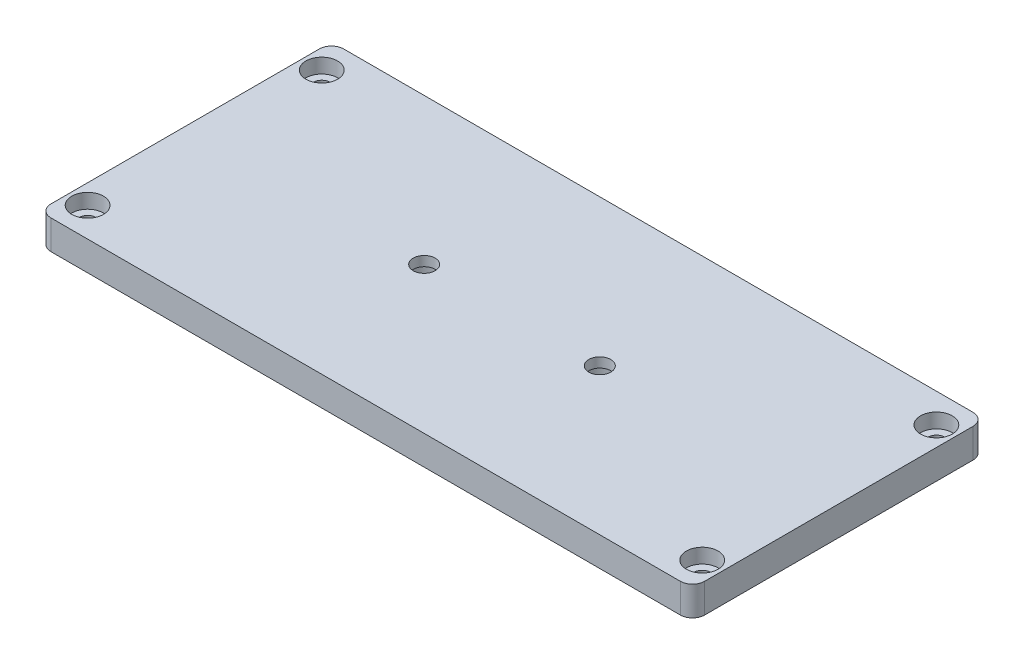
ISO-10303-21;
HEADER;
FILE_DESCRIPTION(('STEP AP214'),'2;1');
FILE_NAME('part.step','',(''),(''),'','','');
FILE_SCHEMA(('AUTOMOTIVE_DESIGN { 1 0 10303 214 1 1 1 1 }'));
ENDSEC;
DATA;
#1=APPLICATION_CONTEXT('core data for automotive mechanical design processes');
#2=APPLICATION_PROTOCOL_DEFINITION('international standard','automotive_design',2000,#1);
#3=PRODUCT_CONTEXT('',#1,'mechanical');
#4=PRODUCT('Part','Part','',(#3));
#5=PRODUCT_RELATED_PRODUCT_CATEGORY('part','',(#4));
#6=PRODUCT_DEFINITION_FORMATION('','',#4);
#7=PRODUCT_DEFINITION_CONTEXT('part definition',#1,'design');
#8=PRODUCT_DEFINITION('design','',#6,#7);
#9=PRODUCT_DEFINITION_SHAPE('','',#8);
#10=(LENGTH_UNIT() NAMED_UNIT(*) SI_UNIT(.MILLI.,.METRE.));
#11=(NAMED_UNIT(*) PLANE_ANGLE_UNIT() SI_UNIT($,.RADIAN.));
#12=(NAMED_UNIT(*) SI_UNIT($,.STERADIAN.) SOLID_ANGLE_UNIT());
#13=UNCERTAINTY_MEASURE_WITH_UNIT(LENGTH_MEASURE(1.E-05),#10,'distance_accuracy_value','');
#14=(GEOMETRIC_REPRESENTATION_CONTEXT(3) GLOBAL_UNCERTAINTY_ASSIGNED_CONTEXT((#13)) GLOBAL_UNIT_ASSIGNED_CONTEXT((#10,
#11,#12)) REPRESENTATION_CONTEXT('',''));
#15=CARTESIAN_POINT('',(0.,0.,0.));
#16=DIRECTION('',(0.,0.,1.));
#17=DIRECTION('',(1.,0.,0.));
#18=AXIS2_PLACEMENT_3D('',#15,#16,#17);
#19=CARTESIAN_POINT('',(0.,0.,0.));
#20=DIRECTION('',(0.,1.,0.));
#21=DIRECTION('',(0.,0.,1.));
#22=AXIS2_PLACEMENT_3D('',#19,#20,#21);
#23=PLANE('',#22);
#24=CARTESIAN_POINT('',(-18.,0.,0.));
#25=DIRECTION('',(0.,-1.,0.));
#26=DIRECTION('',(0.,0.,-1.));
#27=AXIS2_PLACEMENT_3D('',#24,#25,#26);
#28=CIRCLE('',#27,4.);
#29=CARTESIAN_POINT('',(-18.,0.,-4.));
#30=VERTEX_POINT('',#29);
#31=EDGE_CURVE('E605',#30,#30,#28,.T.);
#32=ORIENTED_EDGE('',*,*,#31,.F.);
#33=EDGE_LOOP('',(#32));
#34=FACE_BOUND('',#33,.T.);
#35=CARTESIAN_POINT('',(-63.,0.,-24.));
#36=DIRECTION('',(0.,1.,0.));
#37=DIRECTION('',(0.,0.,1.));
#38=AXIS2_PLACEMENT_3D('',#35,#36,#37);
#39=CIRCLE('',#38,1.7);
#40=CARTESIAN_POINT('',(-63.,0.,-22.3));
#41=VERTEX_POINT('',#40);
#42=EDGE_CURVE('E156',#41,#41,#39,.T.);
#43=ORIENTED_EDGE('',*,*,#42,.T.);
#44=EDGE_LOOP('',(#43));
#45=FACE_BOUND('',#44,.T.);
#46=CARTESIAN_POINT('',(-63.,0.,24.));
#47=DIRECTION('',(0.,1.,0.));
#48=DIRECTION('',(0.,0.,1.));
#49=AXIS2_PLACEMENT_3D('',#46,#47,#48);
#50=CIRCLE('',#49,1.7);
#51=CARTESIAN_POINT('',(-63.,0.,25.7));
#52=VERTEX_POINT('',#51);
#53=EDGE_CURVE('E151',#52,#52,#50,.T.);
#54=ORIENTED_EDGE('',*,*,#53,.T.);
#55=EDGE_LOOP('',(#54));
#56=FACE_BOUND('',#55,.T.);
#57=CARTESIAN_POINT('',(63.,0.,24.));
#58=DIRECTION('',(0.,1.,0.));
#59=DIRECTION('',(0.,0.,1.));
#60=AXIS2_PLACEMENT_3D('',#57,#58,#59);
#61=CIRCLE('',#60,1.69999999999999);
#62=CARTESIAN_POINT('',(63.,0.,25.7));
#63=VERTEX_POINT('',#62);
#64=EDGE_CURVE('E146',#63,#63,#61,.T.);
#65=ORIENTED_EDGE('',*,*,#64,.T.);
#66=EDGE_LOOP('',(#65));
#67=FACE_BOUND('',#66,.T.);
#68=CARTESIAN_POINT('',(63.,0.,-24.));
#69=DIRECTION('',(0.,1.,0.));
#70=DIRECTION('',(0.,0.,1.));
#71=AXIS2_PLACEMENT_3D('',#68,#69,#70);
#72=CIRCLE('',#71,1.69999999999999);
#73=CARTESIAN_POINT('',(63.,0.,-22.3));
#74=VERTEX_POINT('',#73);
#75=EDGE_CURVE('E137',#74,#74,#72,.T.);
#76=ORIENTED_EDGE('',*,*,#75,.T.);
#77=EDGE_LOOP('',(#76));
#78=FACE_BOUND('',#77,.T.);
#79=DIRECTION('',(-1.,0.,0.));
#80=VECTOR('',#79,1.);
#81=CARTESIAN_POINT('',(-67.,0.,-30.));
#82=LINE('',#81,#80);
#83=CARTESIAN_POINT('',(64.5,0.,-30.));
#84=VERTEX_POINT('',#83);
#85=CARTESIAN_POINT('',(-64.5,0.,-30.));
#86=VERTEX_POINT('',#85);
#87=EDGE_CURVE('E122',#84,#86,#82,.T.);
#88=ORIENTED_EDGE('',*,*,#87,.F.);
#89=CARTESIAN_POINT('',(64.5,0.,-27.5));
#90=DIRECTION('',(0.,1.,0.));
#91=DIRECTION('',(0.,0.,1.));
#92=AXIS2_PLACEMENT_3D('',#89,#90,#91);
#93=CIRCLE('',#92,2.5);
#94=CARTESIAN_POINT('',(67.,0.,-27.5));
#95=VERTEX_POINT('',#94);
#96=EDGE_CURVE('E105',#84,#95,#93,.F.);
#97=ORIENTED_EDGE('',*,*,#96,.T.);
#98=DIRECTION('',(0.,0.,-1.));
#99=VECTOR('',#98,1.);
#100=CARTESIAN_POINT('',(67.,0.,-30.));
#101=LINE('',#100,#99);
#102=CARTESIAN_POINT('',(67.,0.,27.5));
#103=VERTEX_POINT('',#102);
#104=EDGE_CURVE('E132',#103,#95,#101,.T.);
#105=ORIENTED_EDGE('',*,*,#104,.F.);
#106=CARTESIAN_POINT('',(64.5,0.,27.5));
#107=DIRECTION('',(0.,1.,0.));
#108=DIRECTION('',(0.,0.,1.));
#109=AXIS2_PLACEMENT_3D('',#106,#107,#108);
#110=CIRCLE('',#109,2.5);
#111=CARTESIAN_POINT('',(64.5,0.,30.));
#112=VERTEX_POINT('',#111);
#113=EDGE_CURVE('E116',#103,#112,#110,.F.);
#114=ORIENTED_EDGE('',*,*,#113,.T.);
#115=DIRECTION('',(1.,0.,0.));
#116=VECTOR('',#115,1.);
#117=CARTESIAN_POINT('',(-67.,0.,30.));
#118=LINE('',#117,#116);
#119=CARTESIAN_POINT('',(-64.5,0.,30.));
#120=VERTEX_POINT('',#119);
#121=EDGE_CURVE('E135',#120,#112,#118,.T.);
#122=ORIENTED_EDGE('',*,*,#121,.F.);
#123=CARTESIAN_POINT('',(-64.5,0.,27.5));
#124=DIRECTION('',(0.,1.,0.));
#125=DIRECTION('',(0.,0.,1.));
#126=AXIS2_PLACEMENT_3D('',#123,#124,#125);
#127=CIRCLE('',#126,2.5);
#128=CARTESIAN_POINT('',(-67.,0.,27.5));
#129=VERTEX_POINT('',#128);
#130=EDGE_CURVE('E164',#120,#129,#127,.F.);
#131=ORIENTED_EDGE('',*,*,#130,.T.);
#132=DIRECTION('',(0.,0.,1.));
#133=VECTOR('',#132,1.);
#134=CARTESIAN_POINT('',(-67.,0.,-30.));
#135=LINE('',#134,#133);
#136=CARTESIAN_POINT('',(-67.,0.,-27.5));
#137=VERTEX_POINT('',#136);
#138=EDGE_CURVE('E131',#137,#129,#135,.T.);
#139=ORIENTED_EDGE('',*,*,#138,.F.);
#140=CARTESIAN_POINT('',(-64.5,0.,-27.5));
#141=DIRECTION('',(0.,1.,0.));
#142=DIRECTION('',(0.,0.,1.));
#143=AXIS2_PLACEMENT_3D('',#140,#141,#142);
#144=CIRCLE('',#143,2.5);
#145=EDGE_CURVE('E126',#137,#86,#144,.F.);
#146=ORIENTED_EDGE('',*,*,#145,.T.);
#147=EDGE_LOOP('',(#88,#97,#105,#114,#122,#131,#139,#146));
#148=FACE_BOUND('',#147,.T.);
#149=CARTESIAN_POINT('',(18.,0.,0.));
#150=DIRECTION('',(0.,-1.,0.));
#151=DIRECTION('',(0.,0.,-1.));
#152=AXIS2_PLACEMENT_3D('',#149,#150,#151);
#153=CIRCLE('',#152,4.);
#154=CARTESIAN_POINT('',(18.,0.,-4.00000000000001));
#155=VERTEX_POINT('',#154);
#156=EDGE_CURVE('E197',#155,#155,#153,.T.);
#157=ORIENTED_EDGE('',*,*,#156,.F.);
#158=EDGE_LOOP('',(#157));
#159=FACE_BOUND('',#158,.T.);
#160=ADVANCED_FACE('F37',(#34,#45,#56,#67,#78,#148,#159),#23,.F.);
#161=CARTESIAN_POINT('',(67.,6.,-30.));
#162=DIRECTION('',(-1.,0.,0.));
#163=DIRECTION('',(0.,0.,1.));
#164=AXIS2_PLACEMENT_3D('',#161,#162,#163);
#165=PLANE('',#164);
#166=ORIENTED_EDGE('',*,*,#104,.T.);
#167=DIRECTION('',(0.,-1.,0.));
#168=VECTOR('',#167,1.);
#169=CARTESIAN_POINT('',(67.,6.,-27.5));
#170=LINE('',#169,#168);
#171=CARTESIAN_POINT('',(67.,6.,-27.5));
#172=VERTEX_POINT('',#171);
#173=EDGE_CURVE('E110',#95,#172,#170,.F.);
#174=ORIENTED_EDGE('',*,*,#173,.T.);
#175=DIRECTION('',(0.,0.,-1.));
#176=VECTOR('',#175,1.);
#177=CARTESIAN_POINT('',(67.,6.,-30.));
#178=LINE('',#177,#176);
#179=CARTESIAN_POINT('',(67.,6.,27.5));
#180=VERTEX_POINT('',#179);
#181=EDGE_CURVE('E142',#180,#172,#178,.T.);
#182=ORIENTED_EDGE('',*,*,#181,.F.);
#183=DIRECTION('',(0.,-1.,0.));
#184=VECTOR('',#183,1.);
#185=CARTESIAN_POINT('',(67.,6.,27.5));
#186=LINE('',#185,#184);
#187=EDGE_CURVE('E115',#180,#103,#186,.T.);
#188=ORIENTED_EDGE('',*,*,#187,.T.);
#189=EDGE_LOOP('',(#166,#174,#182,#188));
#190=FACE_BOUND('',#189,.T.);
#191=ADVANCED_FACE('F238',(#190),#165,.F.);
#192=CARTESIAN_POINT('',(-67.,6.,-30.));
#193=DIRECTION('',(0.,0.,1.));
#194=DIRECTION('',(1.,0.,0.));
#195=AXIS2_PLACEMENT_3D('',#192,#193,#194);
#196=PLANE('',#195);
#197=DIRECTION('',(-1.,0.,0.));
#198=VECTOR('',#197,1.);
#199=CARTESIAN_POINT('',(-67.,6.,-30.));
#200=LINE('',#199,#198);
#201=CARTESIAN_POINT('',(64.5,6.,-30.));
#202=VERTEX_POINT('',#201);
#203=CARTESIAN_POINT('',(-64.5,6.,-30.));
#204=VERTEX_POINT('',#203);
#205=EDGE_CURVE('E125',#202,#204,#200,.T.);
#206=ORIENTED_EDGE('',*,*,#205,.F.);
#207=DIRECTION('',(0.,-1.,0.));
#208=VECTOR('',#207,1.);
#209=CARTESIAN_POINT('',(64.5,6.,-30.));
#210=LINE('',#209,#208);
#211=EDGE_CURVE('E109',#202,#84,#210,.T.);
#212=ORIENTED_EDGE('',*,*,#211,.T.);
#213=ORIENTED_EDGE('',*,*,#87,.T.);
#214=DIRECTION('',(0.,-1.,0.));
#215=VECTOR('',#214,1.);
#216=CARTESIAN_POINT('',(-64.5,6.,-30.));
#217=LINE('',#216,#215);
#218=EDGE_CURVE('E127',#86,#204,#217,.F.);
#219=ORIENTED_EDGE('',*,*,#218,.T.);
#220=EDGE_LOOP('',(#206,#212,#213,#219));
#221=FACE_BOUND('',#220,.T.);
#222=ADVANCED_FACE('F121',(#221),#196,.F.);
#223=CARTESIAN_POINT('',(-67.,6.,-30.));
#224=DIRECTION('',(1.,0.,0.));
#225=DIRECTION('',(0.,0.,-1.));
#226=AXIS2_PLACEMENT_3D('',#223,#224,#225);
#227=PLANE('',#226);
#228=ORIENTED_EDGE('',*,*,#138,.T.);
#229=DIRECTION('',(0.,-1.,0.));
#230=VECTOR('',#229,1.);
#231=CARTESIAN_POINT('',(-67.,6.,27.5));
#232=LINE('',#231,#230);
#233=CARTESIAN_POINT('',(-67.,6.,27.5));
#234=VERTEX_POINT('',#233);
#235=EDGE_CURVE('E11',#129,#234,#232,.F.);
#236=ORIENTED_EDGE('',*,*,#235,.T.);
#237=DIRECTION('',(0.,0.,1.));
#238=VECTOR('',#237,1.);
#239=CARTESIAN_POINT('',(-67.,6.,-30.));
#240=LINE('',#239,#238);
#241=CARTESIAN_POINT('',(-67.,6.,-27.5));
#242=VERTEX_POINT('',#241);
#243=EDGE_CURVE('E229',#242,#234,#240,.T.);
#244=ORIENTED_EDGE('',*,*,#243,.F.);
#245=DIRECTION('',(0.,-1.,0.));
#246=VECTOR('',#245,1.);
#247=CARTESIAN_POINT('',(-67.,6.,-27.5));
#248=LINE('',#247,#246);
#249=EDGE_CURVE('E46',#242,#137,#248,.T.);
#250=ORIENTED_EDGE('',*,*,#249,.T.);
#251=EDGE_LOOP('',(#228,#236,#244,#250));
#252=FACE_BOUND('',#251,.T.);
#253=ADVANCED_FACE('F245',(#252),#227,.F.);
#254=CARTESIAN_POINT('',(-67.,6.,30.));
#255=DIRECTION('',(0.,0.,-1.));
#256=DIRECTION('',(-1.,0.,0.));
#257=AXIS2_PLACEMENT_3D('',#254,#255,#256);
#258=PLANE('',#257);
#259=ORIENTED_EDGE('',*,*,#121,.T.);
#260=DIRECTION('',(0.,-1.,0.));
#261=VECTOR('',#260,1.);
#262=CARTESIAN_POINT('',(64.5,6.,30.));
#263=LINE('',#262,#261);
#264=CARTESIAN_POINT('',(64.5,6.,30.));
#265=VERTEX_POINT('',#264);
#266=EDGE_CURVE('E54',#112,#265,#263,.F.);
#267=ORIENTED_EDGE('',*,*,#266,.T.);
#268=DIRECTION('',(1.,0.,0.));
#269=VECTOR('',#268,1.);
#270=CARTESIAN_POINT('',(-67.,6.,30.));
#271=LINE('',#270,#269);
#272=CARTESIAN_POINT('',(-64.5,6.,30.));
#273=VERTEX_POINT('',#272);
#274=EDGE_CURVE('E161',#273,#265,#271,.T.);
#275=ORIENTED_EDGE('',*,*,#274,.F.);
#276=DIRECTION('',(0.,-1.,0.));
#277=VECTOR('',#276,1.);
#278=CARTESIAN_POINT('',(-64.5,6.,30.));
#279=LINE('',#278,#277);
#280=EDGE_CURVE('E177',#273,#120,#279,.T.);
#281=ORIENTED_EDGE('',*,*,#280,.T.);
#282=EDGE_LOOP('',(#259,#267,#275,#281));
#283=FACE_BOUND('',#282,.T.);
#284=ADVANCED_FACE('F240',(#283),#258,.F.);
#285=CARTESIAN_POINT('',(0.,6.,0.));
#286=DIRECTION('',(0.,1.,0.));
#287=DIRECTION('',(0.,0.,1.));
#288=AXIS2_PLACEMENT_3D('',#285,#286,#287);
#289=PLANE('',#288);
#290=CARTESIAN_POINT('',(-18.,6.,0.));
#291=DIRECTION('',(0.,1.,0.));
#292=DIRECTION('',(0.,0.,1.));
#293=AXIS2_PLACEMENT_3D('',#290,#291,#292);
#294=CIRCLE('',#293,2.25);
#295=CARTESIAN_POINT('',(-18.,6.,2.25));
#296=VERTEX_POINT('',#295);
#297=EDGE_CURVE('E41',#296,#296,#294,.T.);
#298=ORIENTED_EDGE('',*,*,#297,.F.);
#299=EDGE_LOOP('',(#298));
#300=FACE_BOUND('',#299,.T.);
#301=CARTESIAN_POINT('',(18.,6.,0.));
#302=DIRECTION('',(0.,1.,0.));
#303=DIRECTION('',(0.,0.,1.));
#304=AXIS2_PLACEMENT_3D('',#301,#302,#303);
#305=CIRCLE('',#304,2.25);
#306=CARTESIAN_POINT('',(18.,6.,2.24999999999999));
#307=VERTEX_POINT('',#306);
#308=EDGE_CURVE('E182',#307,#307,#305,.T.);
#309=ORIENTED_EDGE('',*,*,#308,.F.);
#310=EDGE_LOOP('',(#309));
#311=FACE_BOUND('',#310,.T.);
#312=CARTESIAN_POINT('',(-63.,6.,-24.));
#313=DIRECTION('',(0.,1.,0.));
#314=DIRECTION('',(0.,0.,1.));
#315=AXIS2_PLACEMENT_3D('',#312,#313,#314);
#316=CIRCLE('',#315,3.25);
#317=CARTESIAN_POINT('',(-63.,6.,-20.75));
#318=VERTEX_POINT('',#317);
#319=EDGE_CURVE('E184',#318,#318,#316,.T.);
#320=ORIENTED_EDGE('',*,*,#319,.F.);
#321=EDGE_LOOP('',(#320));
#322=FACE_BOUND('',#321,.T.);
#323=CARTESIAN_POINT('',(-63.,6.,24.));
#324=DIRECTION('',(0.,1.,0.));
#325=DIRECTION('',(0.,0.,1.));
#326=AXIS2_PLACEMENT_3D('',#323,#324,#325);
#327=CIRCLE('',#326,3.25);
#328=CARTESIAN_POINT('',(-63.,6.,27.25));
#329=VERTEX_POINT('',#328);
#330=EDGE_CURVE('E159',#329,#329,#327,.T.);
#331=ORIENTED_EDGE('',*,*,#330,.F.);
#332=EDGE_LOOP('',(#331));
#333=FACE_BOUND('',#332,.T.);
#334=CARTESIAN_POINT('',(63.,6.,24.));
#335=DIRECTION('',(0.,1.,0.));
#336=DIRECTION('',(0.,0.,1.));
#337=AXIS2_PLACEMENT_3D('',#334,#335,#336);
#338=CIRCLE('',#337,3.25);
#339=CARTESIAN_POINT('',(63.,6.,27.25));
#340=VERTEX_POINT('',#339);
#341=EDGE_CURVE('E154',#340,#340,#338,.T.);
#342=ORIENTED_EDGE('',*,*,#341,.F.);
#343=EDGE_LOOP('',(#342));
#344=FACE_BOUND('',#343,.T.);
#345=CARTESIAN_POINT('',(63.,6.,-24.));
#346=DIRECTION('',(0.,1.,0.));
#347=DIRECTION('',(0.,0.,1.));
#348=AXIS2_PLACEMENT_3D('',#345,#346,#347);
#349=CIRCLE('',#348,3.25);
#350=CARTESIAN_POINT('',(63.,6.,-20.75));
#351=VERTEX_POINT('',#350);
#352=EDGE_CURVE('E149',#351,#351,#349,.T.);
#353=ORIENTED_EDGE('',*,*,#352,.F.);
#354=EDGE_LOOP('',(#353));
#355=FACE_BOUND('',#354,.T.);
#356=ORIENTED_EDGE('',*,*,#181,.T.);
#357=CARTESIAN_POINT('',(64.5,6.,-27.5));
#358=DIRECTION('',(0.,1.,0.));
#359=DIRECTION('',(0.,0.,1.));
#360=AXIS2_PLACEMENT_3D('',#357,#358,#359);
#361=CIRCLE('',#360,2.5);
#362=EDGE_CURVE('E175',#172,#202,#361,.T.);
#363=ORIENTED_EDGE('',*,*,#362,.T.);
#364=ORIENTED_EDGE('',*,*,#205,.T.);
#365=CARTESIAN_POINT('',(-64.5,6.,-27.5));
#366=DIRECTION('',(0.,1.,0.));
#367=DIRECTION('',(0.,0.,1.));
#368=AXIS2_PLACEMENT_3D('',#365,#366,#367);
#369=CIRCLE('',#368,2.5);
#370=EDGE_CURVE('E170',#204,#242,#369,.T.);
#371=ORIENTED_EDGE('',*,*,#370,.T.);
#372=ORIENTED_EDGE('',*,*,#243,.T.);
#373=CARTESIAN_POINT('',(-64.5,6.,27.5));
#374=DIRECTION('',(0.,1.,0.));
#375=DIRECTION('',(0.,0.,1.));
#376=AXIS2_PLACEMENT_3D('',#373,#374,#375);
#377=CIRCLE('',#376,2.5);
#378=EDGE_CURVE('E61',#234,#273,#377,.T.);
#379=ORIENTED_EDGE('',*,*,#378,.T.);
#380=ORIENTED_EDGE('',*,*,#274,.T.);
#381=CARTESIAN_POINT('',(64.5,6.,27.5));
#382=DIRECTION('',(0.,1.,0.));
#383=DIRECTION('',(0.,0.,1.));
#384=AXIS2_PLACEMENT_3D('',#381,#382,#383);
#385=CIRCLE('',#384,2.5);
#386=EDGE_CURVE('E173',#265,#180,#385,.T.);
#387=ORIENTED_EDGE('',*,*,#386,.T.);
#388=EDGE_LOOP('',(#356,#363,#364,#371,#372,#379,#380,#387));
#389=FACE_BOUND('',#388,.T.);
#390=ADVANCED_FACE('F231',(#300,#311,#322,#333,#344,#355,#389),#289,.T.);
#391=CARTESIAN_POINT('',(63.,6.,-24.));
#392=DIRECTION('',(0.,1.,0.));
#393=DIRECTION('',(0.,0.,1.));
#394=AXIS2_PLACEMENT_3D('',#391,#392,#393);
#395=CYLINDRICAL_SURFACE('',#394,1.69999999999999);
#396=CARTESIAN_POINT('',(63.,3.,-24.));
#397=DIRECTION('',(0.,1.,0.));
#398=DIRECTION('',(0.,0.,1.));
#399=AXIS2_PLACEMENT_3D('',#396,#397,#398);
#400=CIRCLE('',#399,1.69999999999999);
#401=CARTESIAN_POINT('',(63.,3.,-22.3));
#402=VERTEX_POINT('',#401);
#403=EDGE_CURVE('E145',#402,#402,#400,.T.);
#404=ORIENTED_EDGE('',*,*,#403,.T.);
#405=EDGE_LOOP('',(#404));
#406=FACE_BOUND('',#405,.T.);
#407=ORIENTED_EDGE('',*,*,#75,.F.);
#408=EDGE_LOOP('',(#407));
#409=FACE_BOUND('',#408,.T.);
#410=ADVANCED_FACE('F309',(#406,#409),#395,.F.);
#411=CARTESIAN_POINT('',(64.7,3.,-24.));
#412=DIRECTION('',(0.,-1.,0.));
#413=DIRECTION('',(0.,0.,-1.));
#414=AXIS2_PLACEMENT_3D('',#411,#412,#413);
#415=PLANE('',#414);
#416=ORIENTED_EDGE('',*,*,#403,.F.);
#417=EDGE_LOOP('',(#416));
#418=FACE_BOUND('',#417,.T.);
#419=CARTESIAN_POINT('',(63.,3.,-24.));
#420=DIRECTION('',(0.,1.,0.));
#421=DIRECTION('',(0.,0.,1.));
#422=AXIS2_PLACEMENT_3D('',#419,#420,#421);
#423=CIRCLE('',#422,3.25);
#424=CARTESIAN_POINT('',(63.,3.,-20.75));
#425=VERTEX_POINT('',#424);
#426=EDGE_CURVE('E221',#425,#425,#423,.T.);
#427=ORIENTED_EDGE('',*,*,#426,.T.);
#428=EDGE_LOOP('',(#427));
#429=FACE_BOUND('',#428,.T.);
#430=ADVANCED_FACE('F423',(#418,#429),#415,.F.);
#431=CARTESIAN_POINT('',(63.,6.,-24.));
#432=DIRECTION('',(0.,1.,0.));
#433=DIRECTION('',(0.,0.,1.));
#434=AXIS2_PLACEMENT_3D('',#431,#432,#433);
#435=CYLINDRICAL_SURFACE('',#434,3.25);
#436=ORIENTED_EDGE('',*,*,#426,.F.);
#437=EDGE_LOOP('',(#436));
#438=FACE_BOUND('',#437,.T.);
#439=ORIENTED_EDGE('',*,*,#352,.T.);
#440=EDGE_LOOP('',(#439));
#441=FACE_BOUND('',#440,.T.);
#442=ADVANCED_FACE('F419',(#438,#441),#435,.F.);
#443=CARTESIAN_POINT('',(63.,6.,24.));
#444=DIRECTION('',(0.,1.,0.));
#445=DIRECTION('',(0.,0.,1.));
#446=AXIS2_PLACEMENT_3D('',#443,#444,#445);
#447=CYLINDRICAL_SURFACE('',#446,1.69999999999999);
#448=CARTESIAN_POINT('',(63.,3.,24.));
#449=DIRECTION('',(0.,1.,0.));
#450=DIRECTION('',(0.,0.,1.));
#451=AXIS2_PLACEMENT_3D('',#448,#449,#450);
#452=CIRCLE('',#451,1.69999999999999);
#453=CARTESIAN_POINT('',(63.,3.,25.7));
#454=VERTEX_POINT('',#453);
#455=EDGE_CURVE('E150',#454,#454,#452,.T.);
#456=ORIENTED_EDGE('',*,*,#455,.T.);
#457=EDGE_LOOP('',(#456));
#458=FACE_BOUND('',#457,.T.);
#459=ORIENTED_EDGE('',*,*,#64,.F.);
#460=EDGE_LOOP('',(#459));
#461=FACE_BOUND('',#460,.T.);
#462=ADVANCED_FACE('F415',(#458,#461),#447,.F.);
#463=CARTESIAN_POINT('',(64.7,3.,24.));
#464=DIRECTION('',(0.,-1.,0.));
#465=DIRECTION('',(0.,0.,-1.));
#466=AXIS2_PLACEMENT_3D('',#463,#464,#465);
#467=PLANE('',#466);
#468=ORIENTED_EDGE('',*,*,#455,.F.);
#469=EDGE_LOOP('',(#468));
#470=FACE_BOUND('',#469,.T.);
#471=CARTESIAN_POINT('',(63.,3.,24.));
#472=DIRECTION('',(0.,1.,0.));
#473=DIRECTION('',(0.,0.,1.));
#474=AXIS2_PLACEMENT_3D('',#471,#472,#473);
#475=CIRCLE('',#474,3.25);
#476=CARTESIAN_POINT('',(63.,3.,27.25));
#477=VERTEX_POINT('',#476);
#478=EDGE_CURVE('E214',#477,#477,#475,.T.);
#479=ORIENTED_EDGE('',*,*,#478,.T.);
#480=EDGE_LOOP('',(#479));
#481=FACE_BOUND('',#480,.T.);
#482=ADVANCED_FACE('F411',(#470,#481),#467,.F.);
#483=CARTESIAN_POINT('',(63.,6.,24.));
#484=DIRECTION('',(0.,1.,0.));
#485=DIRECTION('',(0.,0.,1.));
#486=AXIS2_PLACEMENT_3D('',#483,#484,#485);
#487=CYLINDRICAL_SURFACE('',#486,3.25);
#488=ORIENTED_EDGE('',*,*,#478,.F.);
#489=EDGE_LOOP('',(#488));
#490=FACE_BOUND('',#489,.T.);
#491=ORIENTED_EDGE('',*,*,#341,.T.);
#492=EDGE_LOOP('',(#491));
#493=FACE_BOUND('',#492,.T.);
#494=ADVANCED_FACE('F407',(#490,#493),#487,.F.);
#495=CARTESIAN_POINT('',(-63.,6.,24.));
#496=DIRECTION('',(0.,1.,0.));
#497=DIRECTION('',(0.,0.,1.));
#498=AXIS2_PLACEMENT_3D('',#495,#496,#497);
#499=CYLINDRICAL_SURFACE('',#498,1.7);
#500=CARTESIAN_POINT('',(-63.,3.,24.));
#501=DIRECTION('',(0.,1.,0.));
#502=DIRECTION('',(0.,0.,1.));
#503=AXIS2_PLACEMENT_3D('',#500,#501,#502);
#504=CIRCLE('',#503,1.7);
#505=CARTESIAN_POINT('',(-63.,3.,25.7));
#506=VERTEX_POINT('',#505);
#507=EDGE_CURVE('E155',#506,#506,#504,.T.);
#508=ORIENTED_EDGE('',*,*,#507,.T.);
#509=EDGE_LOOP('',(#508));
#510=FACE_BOUND('',#509,.T.);
#511=ORIENTED_EDGE('',*,*,#53,.F.);
#512=EDGE_LOOP('',(#511));
#513=FACE_BOUND('',#512,.T.);
#514=ADVANCED_FACE('F403',(#510,#513),#499,.F.);
#515=CARTESIAN_POINT('',(-61.3,3.,24.));
#516=DIRECTION('',(0.,-1.,0.));
#517=DIRECTION('',(0.,0.,-1.));
#518=AXIS2_PLACEMENT_3D('',#515,#516,#517);
#519=PLANE('',#518);
#520=ORIENTED_EDGE('',*,*,#507,.F.);
#521=EDGE_LOOP('',(#520));
#522=FACE_BOUND('',#521,.T.);
#523=CARTESIAN_POINT('',(-63.,3.,24.));
#524=DIRECTION('',(0.,1.,0.));
#525=DIRECTION('',(0.,0.,1.));
#526=AXIS2_PLACEMENT_3D('',#523,#524,#525);
#527=CIRCLE('',#526,3.25);
#528=CARTESIAN_POINT('',(-63.,3.,27.25));
#529=VERTEX_POINT('',#528);
#530=EDGE_CURVE('E207',#529,#529,#527,.T.);
#531=ORIENTED_EDGE('',*,*,#530,.T.);
#532=EDGE_LOOP('',(#531));
#533=FACE_BOUND('',#532,.T.);
#534=ADVANCED_FACE('F399',(#522,#533),#519,.F.);
#535=CARTESIAN_POINT('',(-63.,6.,24.));
#536=DIRECTION('',(0.,1.,0.));
#537=DIRECTION('',(0.,0.,1.));
#538=AXIS2_PLACEMENT_3D('',#535,#536,#537);
#539=CYLINDRICAL_SURFACE('',#538,3.25);
#540=ORIENTED_EDGE('',*,*,#530,.F.);
#541=EDGE_LOOP('',(#540));
#542=FACE_BOUND('',#541,.T.);
#543=ORIENTED_EDGE('',*,*,#330,.T.);
#544=EDGE_LOOP('',(#543));
#545=FACE_BOUND('',#544,.T.);
#546=ADVANCED_FACE('F395',(#542,#545),#539,.F.);
#547=CARTESIAN_POINT('',(-63.,6.,-24.));
#548=DIRECTION('',(0.,1.,0.));
#549=DIRECTION('',(0.,0.,1.));
#550=AXIS2_PLACEMENT_3D('',#547,#548,#549);
#551=CYLINDRICAL_SURFACE('',#550,1.7);
#552=CARTESIAN_POINT('',(-63.,3.,-24.));
#553=DIRECTION('',(0.,1.,0.));
#554=DIRECTION('',(0.,0.,1.));
#555=AXIS2_PLACEMENT_3D('',#552,#553,#554);
#556=CIRCLE('',#555,1.7);
#557=CARTESIAN_POINT('',(-63.,3.,-22.3));
#558=VERTEX_POINT('',#557);
#559=EDGE_CURVE('E160',#558,#558,#556,.T.);
#560=ORIENTED_EDGE('',*,*,#559,.T.);
#561=EDGE_LOOP('',(#560));
#562=FACE_BOUND('',#561,.T.);
#563=ORIENTED_EDGE('',*,*,#42,.F.);
#564=EDGE_LOOP('',(#563));
#565=FACE_BOUND('',#564,.T.);
#566=ADVANCED_FACE('F391',(#562,#565),#551,.F.);
#567=CARTESIAN_POINT('',(-61.3,3.,-24.));
#568=DIRECTION('',(0.,-1.,0.));
#569=DIRECTION('',(0.,0.,-1.));
#570=AXIS2_PLACEMENT_3D('',#567,#568,#569);
#571=PLANE('',#570);
#572=ORIENTED_EDGE('',*,*,#559,.F.);
#573=EDGE_LOOP('',(#572));
#574=FACE_BOUND('',#573,.T.);
#575=CARTESIAN_POINT('',(-63.,3.,-24.));
#576=DIRECTION('',(0.,1.,0.));
#577=DIRECTION('',(0.,0.,1.));
#578=AXIS2_PLACEMENT_3D('',#575,#576,#577);
#579=CIRCLE('',#578,3.25);
#580=CARTESIAN_POINT('',(-63.,3.,-20.75));
#581=VERTEX_POINT('',#580);
#582=EDGE_CURVE('E189',#581,#581,#579,.T.);
#583=ORIENTED_EDGE('',*,*,#582,.T.);
#584=EDGE_LOOP('',(#583));
#585=FACE_BOUND('',#584,.T.);
#586=ADVANCED_FACE('F387',(#574,#585),#571,.F.);
#587=CARTESIAN_POINT('',(-63.,6.,-24.));
#588=DIRECTION('',(0.,1.,0.));
#589=DIRECTION('',(0.,0.,1.));
#590=AXIS2_PLACEMENT_3D('',#587,#588,#589);
#591=CYLINDRICAL_SURFACE('',#590,3.25);
#592=ORIENTED_EDGE('',*,*,#582,.F.);
#593=EDGE_LOOP('',(#592));
#594=FACE_BOUND('',#593,.T.);
#595=ORIENTED_EDGE('',*,*,#319,.T.);
#596=EDGE_LOOP('',(#595));
#597=FACE_BOUND('',#596,.T.);
#598=ADVANCED_FACE('F278',(#594,#597),#591,.F.);
#599=CARTESIAN_POINT('',(64.5,6.,-27.5));
#600=DIRECTION('',(0.,-1.,0.));
#601=DIRECTION('',(0.,0.,-1.));
#602=AXIS2_PLACEMENT_3D('',#599,#600,#601);
#603=CYLINDRICAL_SURFACE('',#602,2.5);
#604=ORIENTED_EDGE('',*,*,#362,.F.);
#605=ORIENTED_EDGE('',*,*,#173,.F.);
#606=ORIENTED_EDGE('',*,*,#96,.F.);
#607=ORIENTED_EDGE('',*,*,#211,.F.);
#608=EDGE_LOOP('',(#604,#605,#606,#607));
#609=FACE_BOUND('',#608,.T.);
#610=ADVANCED_FACE('F108',(#609),#603,.T.);
#611=CARTESIAN_POINT('',(64.5,6.,27.5));
#612=DIRECTION('',(0.,-1.,0.));
#613=DIRECTION('',(0.,0.,-1.));
#614=AXIS2_PLACEMENT_3D('',#611,#612,#613);
#615=CYLINDRICAL_SURFACE('',#614,2.5);
#616=ORIENTED_EDGE('',*,*,#386,.F.);
#617=ORIENTED_EDGE('',*,*,#266,.F.);
#618=ORIENTED_EDGE('',*,*,#113,.F.);
#619=ORIENTED_EDGE('',*,*,#187,.F.);
#620=EDGE_LOOP('',(#616,#617,#618,#619));
#621=FACE_BOUND('',#620,.T.);
#622=ADVANCED_FACE('F236',(#621),#615,.T.);
#623=CARTESIAN_POINT('',(-64.5,6.,27.5));
#624=DIRECTION('',(0.,-1.,0.));
#625=DIRECTION('',(0.,0.,-1.));
#626=AXIS2_PLACEMENT_3D('',#623,#624,#625);
#627=CYLINDRICAL_SURFACE('',#626,2.5);
#628=ORIENTED_EDGE('',*,*,#378,.F.);
#629=ORIENTED_EDGE('',*,*,#235,.F.);
#630=ORIENTED_EDGE('',*,*,#130,.F.);
#631=ORIENTED_EDGE('',*,*,#280,.F.);
#632=EDGE_LOOP('',(#628,#629,#630,#631));
#633=FACE_BOUND('',#632,.T.);
#634=ADVANCED_FACE('F242',(#633),#627,.T.);
#635=CARTESIAN_POINT('',(-64.5,6.,-27.5));
#636=DIRECTION('',(0.,-1.,0.));
#637=DIRECTION('',(0.,0.,-1.));
#638=AXIS2_PLACEMENT_3D('',#635,#636,#637);
#639=CYLINDRICAL_SURFACE('',#638,2.5);
#640=ORIENTED_EDGE('',*,*,#370,.F.);
#641=ORIENTED_EDGE('',*,*,#218,.F.);
#642=ORIENTED_EDGE('',*,*,#145,.F.);
#643=ORIENTED_EDGE('',*,*,#249,.F.);
#644=EDGE_LOOP('',(#640,#641,#642,#643));
#645=FACE_BOUND('',#644,.T.);
#646=ADVANCED_FACE('F39',(#645),#639,.T.);
#647=CARTESIAN_POINT('',(18.,0.,0.));
#648=DIRECTION('',(0.,-1.,0.));
#649=DIRECTION('',(0.,0.,-1.));
#650=AXIS2_PLACEMENT_3D('',#647,#648,#649);
#651=CYLINDRICAL_SURFACE('',#650,2.25);
#652=ORIENTED_EDGE('',*,*,#308,.T.);
#653=EDGE_LOOP('',(#652));
#654=FACE_BOUND('',#653,.T.);
#655=CARTESIAN_POINT('',(18.,4.,0.));
#656=DIRECTION('',(0.,-1.,0.));
#657=DIRECTION('',(0.,0.,-1.));
#658=AXIS2_PLACEMENT_3D('',#655,#656,#657);
#659=CIRCLE('',#658,2.25);
#660=CARTESIAN_POINT('',(18.,4.,-2.25));
#661=VERTEX_POINT('',#660);
#662=EDGE_CURVE('E185',#661,#661,#659,.T.);
#663=ORIENTED_EDGE('',*,*,#662,.T.);
#664=EDGE_LOOP('',(#663));
#665=FACE_BOUND('',#664,.T.);
#666=ADVANCED_FACE('F251',(#654,#665),#651,.F.);
#667=CARTESIAN_POINT('',(20.25,4.,0.));
#668=DIRECTION('',(0.,1.,0.));
#669=DIRECTION('',(0.,0.,1.));
#670=AXIS2_PLACEMENT_3D('',#667,#668,#669);
#671=PLANE('',#670);
#672=ORIENTED_EDGE('',*,*,#662,.F.);
#673=EDGE_LOOP('',(#672));
#674=FACE_BOUND('',#673,.T.);
#675=CARTESIAN_POINT('',(18.,4.,0.));
#676=DIRECTION('',(0.,-1.,0.));
#677=DIRECTION('',(0.,0.,-1.));
#678=AXIS2_PLACEMENT_3D('',#675,#676,#677);
#679=CIRCLE('',#678,4.);
#680=CARTESIAN_POINT('',(18.,4.,-4.00000000000001));
#681=VERTEX_POINT('',#680);
#682=EDGE_CURVE('E192',#681,#681,#679,.T.);
#683=ORIENTED_EDGE('',*,*,#682,.T.);
#684=EDGE_LOOP('',(#683));
#685=FACE_BOUND('',#684,.T.);
#686=ADVANCED_FACE('F256',(#674,#685),#671,.F.);
#687=CARTESIAN_POINT('',(18.,0.,0.));
#688=DIRECTION('',(0.,-1.,0.));
#689=DIRECTION('',(0.,0.,-1.));
#690=AXIS2_PLACEMENT_3D('',#687,#688,#689);
#691=CYLINDRICAL_SURFACE('',#690,4.);
#692=ORIENTED_EDGE('',*,*,#682,.F.);
#693=EDGE_LOOP('',(#692));
#694=FACE_BOUND('',#693,.T.);
#695=ORIENTED_EDGE('',*,*,#156,.T.);
#696=EDGE_LOOP('',(#695));
#697=FACE_BOUND('',#696,.T.);
#698=ADVANCED_FACE('F328',(#694,#697),#691,.F.);
#699=CARTESIAN_POINT('',(-18.,0.,0.));
#700=DIRECTION('',(0.,-1.,0.));
#701=DIRECTION('',(0.,0.,-1.));
#702=AXIS2_PLACEMENT_3D('',#699,#700,#701);
#703=CYLINDRICAL_SURFACE('',#702,2.25);
#704=ORIENTED_EDGE('',*,*,#297,.T.);
#705=EDGE_LOOP('',(#704));
#706=FACE_BOUND('',#705,.T.);
#707=CARTESIAN_POINT('',(-18.,4.,0.));
#708=DIRECTION('',(0.,-1.,0.));
#709=DIRECTION('',(0.,0.,-1.));
#710=AXIS2_PLACEMENT_3D('',#707,#708,#709);
#711=CIRCLE('',#710,2.25);
#712=CARTESIAN_POINT('',(-18.,4.,-2.24999999999999));
#713=VERTEX_POINT('',#712);
#714=EDGE_CURVE('E607',#713,#713,#711,.T.);
#715=ORIENTED_EDGE('',*,*,#714,.T.);
#716=EDGE_LOOP('',(#715));
#717=FACE_BOUND('',#716,.T.);
#718=ADVANCED_FACE('F339',(#706,#717),#703,.F.);
#719=CARTESIAN_POINT('',(-15.75,4.,0.));
#720=DIRECTION('',(0.,1.,0.));
#721=DIRECTION('',(0.,0.,1.));
#722=AXIS2_PLACEMENT_3D('',#719,#720,#721);
#723=PLANE('',#722);
#724=ORIENTED_EDGE('',*,*,#714,.F.);
#725=EDGE_LOOP('',(#724));
#726=FACE_BOUND('',#725,.T.);
#727=CARTESIAN_POINT('',(-18.,4.,0.));
#728=DIRECTION('',(0.,-1.,0.));
#729=DIRECTION('',(0.,0.,-1.));
#730=AXIS2_PLACEMENT_3D('',#727,#728,#729);
#731=CIRCLE('',#730,4.);
#732=CARTESIAN_POINT('',(-18.,4.,-4.));
#733=VERTEX_POINT('',#732);
#734=EDGE_CURVE('E603',#733,#733,#731,.T.);
#735=ORIENTED_EDGE('',*,*,#734,.T.);
#736=EDGE_LOOP('',(#735));
#737=FACE_BOUND('',#736,.T.);
#738=ADVANCED_FACE('F350',(#726,#737),#723,.F.);
#739=CARTESIAN_POINT('',(-18.,0.,0.));
#740=DIRECTION('',(0.,-1.,0.));
#741=DIRECTION('',(0.,0.,-1.));
#742=AXIS2_PLACEMENT_3D('',#739,#740,#741);
#743=CYLINDRICAL_SURFACE('',#742,4.);
#744=ORIENTED_EDGE('',*,*,#734,.F.);
#745=EDGE_LOOP('',(#744));
#746=FACE_BOUND('',#745,.T.);
#747=ORIENTED_EDGE('',*,*,#31,.T.);
#748=EDGE_LOOP('',(#747));
#749=FACE_BOUND('',#748,.T.);
#750=ADVANCED_FACE('F361',(#746,#749),#743,.F.);
#751=CLOSED_SHELL('',(#160,#191,#222,#253,#284,#390,#410,#430,#442,#462,#482,#494,#514,#534,
#546,#566,#586,#598,#610,#622,#634,#646,#666,#686,#698,#718,#738,#750));
#752=MANIFOLD_SOLID_BREP('B2',#751);
#753=ADVANCED_BREP_SHAPE_REPRESENTATION('',(#18,#752),#14);
#754=SHAPE_DEFINITION_REPRESENTATION(#9,#753);
ENDSEC;
END-ISO-10303-21;
